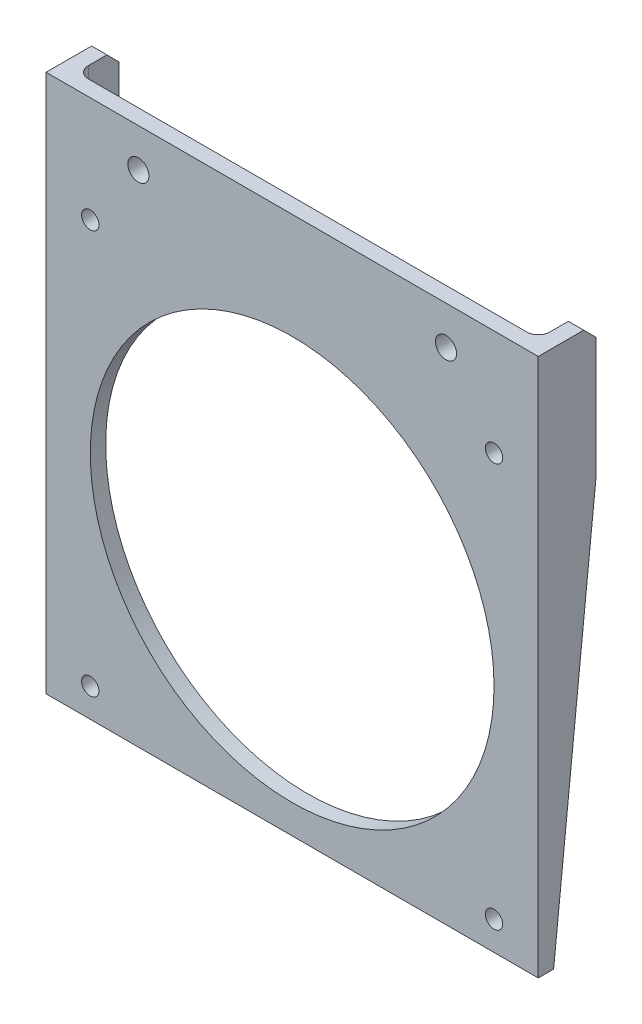
ISO-10303-21;
HEADER;
FILE_DESCRIPTION(('STEP AP214'),'2;1');
FILE_NAME('part.step','',(''),(''),'','','');
FILE_SCHEMA(('AUTOMOTIVE_DESIGN { 1 0 10303 214 1 1 1 1 }'));
ENDSEC;
DATA;
#1=APPLICATION_CONTEXT('core data for automotive mechanical design processes');
#2=APPLICATION_PROTOCOL_DEFINITION('international standard','automotive_design',2000,#1);
#3=PRODUCT_CONTEXT('',#1,'mechanical');
#4=PRODUCT('Part','Part','',(#3));
#5=PRODUCT_RELATED_PRODUCT_CATEGORY('part','',(#4));
#6=PRODUCT_DEFINITION_FORMATION('','',#4);
#7=PRODUCT_DEFINITION_CONTEXT('part definition',#1,'design');
#8=PRODUCT_DEFINITION('design','',#6,#7);
#9=PRODUCT_DEFINITION_SHAPE('','',#8);
#10=(LENGTH_UNIT() NAMED_UNIT(*) SI_UNIT(.MILLI.,.METRE.));
#11=(NAMED_UNIT(*) PLANE_ANGLE_UNIT() SI_UNIT($,.RADIAN.));
#12=(NAMED_UNIT(*) SI_UNIT($,.STERADIAN.) SOLID_ANGLE_UNIT());
#13=UNCERTAINTY_MEASURE_WITH_UNIT(LENGTH_MEASURE(1.E-05),#10,'distance_accuracy_value','');
#14=(GEOMETRIC_REPRESENTATION_CONTEXT(3) GLOBAL_UNCERTAINTY_ASSIGNED_CONTEXT((#13)) GLOBAL_UNIT_ASSIGNED_CONTEXT((#10,
#11,#12)) REPRESENTATION_CONTEXT('',''));
#15=CARTESIAN_POINT('',(0.,0.,0.));
#16=DIRECTION('',(0.,0.,1.));
#17=DIRECTION('',(1.,0.,0.));
#18=AXIS2_PLACEMENT_3D('',#15,#16,#17);
#19=CARTESIAN_POINT('',(0.,0.,4.));
#20=DIRECTION('',(0.,0.,-1.));
#21=DIRECTION('',(-1.,0.,0.));
#22=AXIS2_PLACEMENT_3D('',#19,#20,#21);
#23=PLANE('',#22);
#24=CARTESIAN_POINT('',(20.,130.,4.));
#25=DIRECTION('',(0.,0.,1.));
#26=DIRECTION('',(1.,0.,0.));
#27=AXIS2_PLACEMENT_3D('',#24,#25,#26);
#28=CIRCLE('',#27,2.74999999999999);
#29=CARTESIAN_POINT('',(22.75,130.,4.));
#30=VERTEX_POINT('',#29);
#31=EDGE_CURVE('E229',#30,#30,#28,.T.);
#32=ORIENTED_EDGE('',*,*,#31,.F.);
#33=EDGE_LOOP('',(#32));
#34=FACE_BOUND('',#33,.T.);
#35=CARTESIAN_POINT('',(100.,130.,4.));
#36=DIRECTION('',(0.,0.,1.));
#37=DIRECTION('',(1.,0.,0.));
#38=AXIS2_PLACEMENT_3D('',#35,#36,#37);
#39=CIRCLE('',#38,2.74999999999999);
#40=CARTESIAN_POINT('',(102.75,130.,4.));
#41=VERTEX_POINT('',#40);
#42=EDGE_CURVE('E235',#41,#41,#39,.T.);
#43=ORIENTED_EDGE('',*,*,#42,.F.);
#44=EDGE_LOOP('',(#43));
#45=FACE_BOUND('',#44,.T.);
#46=CARTESIAN_POINT('',(7.5,112.5,4.));
#47=DIRECTION('',(0.,0.,1.));
#48=DIRECTION('',(1.,0.,0.));
#49=AXIS2_PLACEMENT_3D('',#46,#47,#48);
#50=CIRCLE('',#49,2.24999999999999);
#51=CARTESIAN_POINT('',(9.74999999999999,112.5,4.));
#52=VERTEX_POINT('',#51);
#53=EDGE_CURVE('E241',#52,#52,#50,.T.);
#54=ORIENTED_EDGE('',*,*,#53,.F.);
#55=EDGE_LOOP('',(#54));
#56=FACE_BOUND('',#55,.T.);
#57=CARTESIAN_POINT('',(112.5,112.5,4.));
#58=DIRECTION('',(0.,0.,1.));
#59=DIRECTION('',(1.,0.,0.));
#60=AXIS2_PLACEMENT_3D('',#57,#58,#59);
#61=CIRCLE('',#60,2.24999999999999);
#62=CARTESIAN_POINT('',(114.75,112.5,4.));
#63=VERTEX_POINT('',#62);
#64=EDGE_CURVE('E247',#63,#63,#61,.T.);
#65=ORIENTED_EDGE('',*,*,#64,.F.);
#66=EDGE_LOOP('',(#65));
#67=FACE_BOUND('',#66,.T.);
#68=CARTESIAN_POINT('',(112.5,7.5,4.));
#69=DIRECTION('',(0.,0.,1.));
#70=DIRECTION('',(1.,0.,0.));
#71=AXIS2_PLACEMENT_3D('',#68,#69,#70);
#72=CIRCLE('',#71,2.24999999999999);
#73=CARTESIAN_POINT('',(114.75,7.5,4.));
#74=VERTEX_POINT('',#73);
#75=EDGE_CURVE('E253',#74,#74,#72,.T.);
#76=ORIENTED_EDGE('',*,*,#75,.F.);
#77=EDGE_LOOP('',(#76));
#78=FACE_BOUND('',#77,.T.);
#79=CARTESIAN_POINT('',(7.5,7.5,4.));
#80=DIRECTION('',(0.,0.,1.));
#81=DIRECTION('',(1.,0.,0.));
#82=AXIS2_PLACEMENT_3D('',#79,#80,#81);
#83=CIRCLE('',#82,2.24999999999999);
#84=CARTESIAN_POINT('',(9.74999999999999,7.5,4.));
#85=VERTEX_POINT('',#84);
#86=EDGE_CURVE('E259',#85,#85,#83,.T.);
#87=ORIENTED_EDGE('',*,*,#86,.F.);
#88=EDGE_LOOP('',(#87));
#89=FACE_BOUND('',#88,.T.);
#90=DIRECTION('',(-1.,0.,0.));
#91=VECTOR('',#90,1.);
#92=CARTESIAN_POINT('',(0.,140.,4.));
#93=LINE('',#92,#91);
#94=CARTESIAN_POINT('',(124.,140.,4.));
#95=VERTEX_POINT('',#94);
#96=CARTESIAN_POINT('',(-4.,140.,4.));
#97=VERTEX_POINT('',#96);
#98=EDGE_CURVE('E144',#95,#97,#93,.T.);
#99=ORIENTED_EDGE('',*,*,#98,.T.);
#100=DIRECTION('',(0.,-1.,0.));
#101=VECTOR('',#100,1.);
#102=CARTESIAN_POINT('',(-4.,0.,4.));
#103=LINE('',#102,#101);
#104=CARTESIAN_POINT('',(-4.,0.,4.));
#105=VERTEX_POINT('',#104);
#106=EDGE_CURVE('E147',#97,#105,#103,.T.);
#107=ORIENTED_EDGE('',*,*,#106,.T.);
#108=DIRECTION('',(1.,0.,0.));
#109=VECTOR('',#108,1.);
#110=CARTESIAN_POINT('',(0.,0.,4.));
#111=LINE('',#110,#109);
#112=CARTESIAN_POINT('',(124.,0.,4.));
#113=VERTEX_POINT('',#112);
#114=EDGE_CURVE('E156',#105,#113,#111,.T.);
#115=ORIENTED_EDGE('',*,*,#114,.T.);
#116=DIRECTION('',(0.,-1.,0.));
#117=VECTOR('',#116,1.);
#118=CARTESIAN_POINT('',(124.,0.,4.));
#119=LINE('',#118,#117);
#120=EDGE_CURVE('E150',#95,#113,#119,.T.);
#121=ORIENTED_EDGE('',*,*,#120,.F.);
#122=EDGE_LOOP('',(#99,#107,#115,#121));
#123=FACE_BOUND('',#122,.T.);
#124=CARTESIAN_POINT('',(60.,60.,4.));
#125=DIRECTION('',(0.,0.,1.));
#126=DIRECTION('',(1.,0.,0.));
#127=AXIS2_PLACEMENT_3D('',#124,#125,#126);
#128=CIRCLE('',#127,52.5);
#129=CARTESIAN_POINT('',(112.5,60.,4.));
#130=VERTEX_POINT('',#129);
#131=EDGE_CURVE('E266',#130,#130,#128,.T.);
#132=ORIENTED_EDGE('',*,*,#131,.F.);
#133=EDGE_LOOP('',(#132));
#134=FACE_BOUND('',#133,.T.);
#135=ADVANCED_FACE('F39',(#34,#45,#56,#67,#78,#89,#123,#134),#23,.F.);
#136=CARTESIAN_POINT('',(0.,0.,0.));
#137=DIRECTION('',(0.,0.,-1.));
#138=DIRECTION('',(-1.,0.,0.));
#139=AXIS2_PLACEMENT_3D('',#136,#137,#138);
#140=PLANE('',#139);
#141=CARTESIAN_POINT('',(20.,130.,0.));
#142=DIRECTION('',(0.,0.,1.));
#143=DIRECTION('',(1.,0.,0.));
#144=AXIS2_PLACEMENT_3D('',#141,#142,#143);
#145=CIRCLE('',#144,2.75);
#146=CARTESIAN_POINT('',(22.75,130.,0.));
#147=VERTEX_POINT('',#146);
#148=EDGE_CURVE('E232',#147,#147,#145,.T.);
#149=ORIENTED_EDGE('',*,*,#148,.T.);
#150=EDGE_LOOP('',(#149));
#151=FACE_BOUND('',#150,.T.);
#152=CARTESIAN_POINT('',(100.,130.,0.));
#153=DIRECTION('',(0.,0.,1.));
#154=DIRECTION('',(1.,0.,0.));
#155=AXIS2_PLACEMENT_3D('',#152,#153,#154);
#156=CIRCLE('',#155,2.75);
#157=CARTESIAN_POINT('',(102.75,130.,0.));
#158=VERTEX_POINT('',#157);
#159=EDGE_CURVE('E238',#158,#158,#156,.T.);
#160=ORIENTED_EDGE('',*,*,#159,.T.);
#161=EDGE_LOOP('',(#160));
#162=FACE_BOUND('',#161,.T.);
#163=CARTESIAN_POINT('',(7.5,112.5,0.));
#164=DIRECTION('',(0.,0.,1.));
#165=DIRECTION('',(1.,0.,0.));
#166=AXIS2_PLACEMENT_3D('',#163,#164,#165);
#167=CIRCLE('',#166,2.25);
#168=CARTESIAN_POINT('',(9.75,112.5,0.));
#169=VERTEX_POINT('',#168);
#170=EDGE_CURVE('E244',#169,#169,#167,.T.);
#171=ORIENTED_EDGE('',*,*,#170,.T.);
#172=EDGE_LOOP('',(#171));
#173=FACE_BOUND('',#172,.T.);
#174=CARTESIAN_POINT('',(112.5,112.5,0.));
#175=DIRECTION('',(0.,0.,1.));
#176=DIRECTION('',(1.,0.,0.));
#177=AXIS2_PLACEMENT_3D('',#174,#175,#176);
#178=CIRCLE('',#177,2.25);
#179=CARTESIAN_POINT('',(114.75,112.5,0.));
#180=VERTEX_POINT('',#179);
#181=EDGE_CURVE('E250',#180,#180,#178,.T.);
#182=ORIENTED_EDGE('',*,*,#181,.T.);
#183=EDGE_LOOP('',(#182));
#184=FACE_BOUND('',#183,.T.);
#185=CARTESIAN_POINT('',(112.5,7.5,0.));
#186=DIRECTION('',(0.,0.,1.));
#187=DIRECTION('',(1.,0.,0.));
#188=AXIS2_PLACEMENT_3D('',#185,#186,#187);
#189=CIRCLE('',#188,2.25);
#190=CARTESIAN_POINT('',(114.75,7.5,0.));
#191=VERTEX_POINT('',#190);
#192=EDGE_CURVE('E256',#191,#191,#189,.T.);
#193=ORIENTED_EDGE('',*,*,#192,.T.);
#194=EDGE_LOOP('',(#193));
#195=FACE_BOUND('',#194,.T.);
#196=CARTESIAN_POINT('',(7.5,7.5,0.));
#197=DIRECTION('',(0.,0.,1.));
#198=DIRECTION('',(1.,0.,0.));
#199=AXIS2_PLACEMENT_3D('',#196,#197,#198);
#200=CIRCLE('',#199,2.25);
#201=CARTESIAN_POINT('',(9.75,7.5,0.));
#202=VERTEX_POINT('',#201);
#203=EDGE_CURVE('E262',#202,#202,#200,.T.);
#204=ORIENTED_EDGE('',*,*,#203,.T.);
#205=EDGE_LOOP('',(#204));
#206=FACE_BOUND('',#205,.T.);
#207=DIRECTION('',(-1.,0.,0.));
#208=VECTOR('',#207,1.);
#209=CARTESIAN_POINT('',(0.,140.,0.));
#210=LINE('',#209,#208);
#211=CARTESIAN_POINT('',(117.,140.,0.));
#212=VERTEX_POINT('',#211);
#213=CARTESIAN_POINT('',(3.,140.,0.));
#214=VERTEX_POINT('',#213);
#215=EDGE_CURVE('E272',#212,#214,#210,.T.);
#216=ORIENTED_EDGE('',*,*,#215,.F.);
#217=DIRECTION('',(0.,1.,0.));
#218=VECTOR('',#217,1.);
#219=CARTESIAN_POINT('',(117.,0.,0.));
#220=LINE('',#219,#218);
#221=CARTESIAN_POINT('',(117.,0.,0.));
#222=VERTEX_POINT('',#221);
#223=EDGE_CURVE('E279',#212,#222,#220,.F.);
#224=ORIENTED_EDGE('',*,*,#223,.T.);
#225=DIRECTION('',(1.,0.,0.));
#226=VECTOR('',#225,1.);
#227=CARTESIAN_POINT('',(0.,0.,0.));
#228=LINE('',#227,#226);
#229=CARTESIAN_POINT('',(3.,0.,0.));
#230=VERTEX_POINT('',#229);
#231=EDGE_CURVE('E269',#230,#222,#228,.T.);
#232=ORIENTED_EDGE('',*,*,#231,.F.);
#233=DIRECTION('',(0.,-1.,0.));
#234=VECTOR('',#233,1.);
#235=CARTESIAN_POINT('',(3.,140.,0.));
#236=LINE('',#235,#234);
#237=EDGE_CURVE('E79',#230,#214,#236,.F.);
#238=ORIENTED_EDGE('',*,*,#237,.T.);
#239=EDGE_LOOP('',(#216,#224,#232,#238));
#240=FACE_BOUND('',#239,.T.);
#241=CARTESIAN_POINT('',(60.,60.,0.));
#242=DIRECTION('',(0.,0.,1.));
#243=DIRECTION('',(1.,0.,0.));
#244=AXIS2_PLACEMENT_3D('',#241,#242,#243);
#245=CIRCLE('',#244,52.5);
#246=CARTESIAN_POINT('',(112.5,60.,0.));
#247=VERTEX_POINT('',#246);
#248=EDGE_CURVE('E265',#247,#247,#245,.T.);
#249=ORIENTED_EDGE('',*,*,#248,.T.);
#250=EDGE_LOOP('',(#249));
#251=FACE_BOUND('',#250,.T.);
#252=ADVANCED_FACE('F317',(#151,#162,#173,#184,#195,#206,#240,#251),#140,.T.);
#253=CARTESIAN_POINT('',(0.,0.,4.));
#254=DIRECTION('',(0.,1.,0.));
#255=DIRECTION('',(0.,0.,1.));
#256=AXIS2_PLACEMENT_3D('',#253,#254,#255);
#257=PLANE('',#256);
#258=DIRECTION('',(1.,0.,0.));
#259=VECTOR('',#258,1.);
#260=CARTESIAN_POINT('',(-4.,0.,0.));
#261=LINE('',#260,#259);
#262=CARTESIAN_POINT('',(-4.,0.,0.));
#263=VERTEX_POINT('',#262);
#264=EDGE_CURVE('E54',#263,#230,#261,.T.);
#265=ORIENTED_EDGE('',*,*,#264,.T.);
#266=ORIENTED_EDGE('',*,*,#231,.T.);
#267=DIRECTION('',(-1.,0.,0.));
#268=VECTOR('',#267,1.);
#269=CARTESIAN_POINT('',(124.,0.,0.));
#270=LINE('',#269,#268);
#271=CARTESIAN_POINT('',(124.,0.,0.));
#272=VERTEX_POINT('',#271);
#273=EDGE_CURVE('E73',#272,#222,#270,.T.);
#274=ORIENTED_EDGE('',*,*,#273,.F.);
#275=DIRECTION('',(0.,0.,-1.));
#276=VECTOR('',#275,1.);
#277=CARTESIAN_POINT('',(124.,0.,0.));
#278=LINE('',#277,#276);
#279=EDGE_CURVE('E202',#113,#272,#278,.T.);
#280=ORIENTED_EDGE('',*,*,#279,.F.);
#281=ORIENTED_EDGE('',*,*,#114,.F.);
#282=DIRECTION('',(0.,0.,-1.));
#283=VECTOR('',#282,1.);
#284=CARTESIAN_POINT('',(-4.,0.,0.));
#285=LINE('',#284,#283);
#286=EDGE_CURVE('E165',#105,#263,#285,.T.);
#287=ORIENTED_EDGE('',*,*,#286,.T.);
#288=EDGE_LOOP('',(#265,#266,#274,#280,#281,#287));
#289=FACE_BOUND('',#288,.T.);
#290=ADVANCED_FACE('F299',(#289),#257,.F.);
#291=CARTESIAN_POINT('',(0.,140.,4.));
#292=DIRECTION('',(0.,-1.,0.));
#293=DIRECTION('',(0.,0.,-1.));
#294=AXIS2_PLACEMENT_3D('',#291,#292,#293);
#295=PLANE('',#294);
#296=DIRECTION('',(0.,0.,1.));
#297=VECTOR('',#296,1.);
#298=CARTESIAN_POINT('',(120.,140.,4.));
#299=LINE('',#298,#297);
#300=CARTESIAN_POINT('',(120.,140.,-7.82911983394996));
#301=VERTEX_POINT('',#300);
#302=CARTESIAN_POINT('',(120.,140.,-3.));
#303=VERTEX_POINT('',#302);
#304=EDGE_CURVE('E203',#301,#303,#299,.T.);
#305=ORIENTED_EDGE('',*,*,#304,.T.);
#306=CARTESIAN_POINT('',(117.,140.,-3.));
#307=DIRECTION('',(0.,-1.,0.));
#308=DIRECTION('',(0.,0.,-1.));
#309=AXIS2_PLACEMENT_3D('',#306,#307,#308);
#310=CIRCLE('',#309,3.);
#311=EDGE_CURVE('E283',#303,#212,#310,.T.);
#312=ORIENTED_EDGE('',*,*,#311,.T.);
#313=ORIENTED_EDGE('',*,*,#215,.T.);
#314=CARTESIAN_POINT('',(3.,140.,-3.));
#315=DIRECTION('',(0.,-1.,0.));
#316=DIRECTION('',(0.,0.,-1.));
#317=AXIS2_PLACEMENT_3D('',#314,#315,#316);
#318=CIRCLE('',#317,3.);
#319=CARTESIAN_POINT('',(0.,140.,-3.));
#320=VERTEX_POINT('',#319);
#321=EDGE_CURVE('E11',#214,#320,#318,.T.);
#322=ORIENTED_EDGE('',*,*,#321,.T.);
#323=DIRECTION('',(0.,0.,1.));
#324=VECTOR('',#323,1.);
#325=CARTESIAN_POINT('',(0.,140.,4.));
#326=LINE('',#325,#324);
#327=CARTESIAN_POINT('',(0.,140.,-7.82911983394996));
#328=VERTEX_POINT('',#327);
#329=EDGE_CURVE('E183',#328,#320,#326,.T.);
#330=ORIENTED_EDGE('',*,*,#329,.F.);
#331=DIRECTION('',(1.,0.,0.));
#332=VECTOR('',#331,1.);
#333=CARTESIAN_POINT('',(-4.,140.,-7.82911983394996));
#334=LINE('',#333,#332);
#335=CARTESIAN_POINT('',(-4.,140.,-7.82911983394996));
#336=VERTEX_POINT('',#335);
#337=EDGE_CURVE('E171',#336,#328,#334,.T.);
#338=ORIENTED_EDGE('',*,*,#337,.F.);
#339=DIRECTION('',(0.,0.,1.));
#340=VECTOR('',#339,1.);
#341=CARTESIAN_POINT('',(-4.,140.,4.));
#342=LINE('',#341,#340);
#343=EDGE_CURVE('E162',#336,#97,#342,.T.);
#344=ORIENTED_EDGE('',*,*,#343,.T.);
#345=ORIENTED_EDGE('',*,*,#98,.F.);
#346=DIRECTION('',(0.,0.,1.));
#347=VECTOR('',#346,1.);
#348=CARTESIAN_POINT('',(124.,140.,4.));
#349=LINE('',#348,#347);
#350=CARTESIAN_POINT('',(124.,140.,-7.82911983394996));
#351=VERTEX_POINT('',#350);
#352=EDGE_CURVE('E211',#351,#95,#349,.T.);
#353=ORIENTED_EDGE('',*,*,#352,.F.);
#354=DIRECTION('',(-1.,0.,0.));
#355=VECTOR('',#354,1.);
#356=CARTESIAN_POINT('',(124.,140.,-7.82911983394996));
#357=LINE('',#356,#355);
#358=EDGE_CURVE('E213',#351,#301,#357,.T.);
#359=ORIENTED_EDGE('',*,*,#358,.T.);
#360=EDGE_LOOP('',(#305,#312,#313,#322,#330,#338,#344,#345,#353,#359));
#361=FACE_BOUND('',#360,.T.);
#362=ADVANCED_FACE('F169',(#361),#295,.F.);
#363=CARTESIAN_POINT('',(60.,60.,4.));
#364=DIRECTION('',(0.,0.,-1.));
#365=DIRECTION('',(-1.,0.,0.));
#366=AXIS2_PLACEMENT_3D('',#363,#364,#365);
#367=CYLINDRICAL_SURFACE('',#366,52.5);
#368=ORIENTED_EDGE('',*,*,#131,.T.);
#369=EDGE_LOOP('',(#368));
#370=FACE_BOUND('',#369,.T.);
#371=ORIENTED_EDGE('',*,*,#248,.F.);
#372=EDGE_LOOP('',(#371));
#373=FACE_BOUND('',#372,.T.);
#374=ADVANCED_FACE('F324',(#370,#373),#367,.F.);
#375=CARTESIAN_POINT('',(7.5,7.5,4.));
#376=DIRECTION('',(0.,0.,1.));
#377=DIRECTION('',(1.,0.,0.));
#378=AXIS2_PLACEMENT_3D('',#375,#376,#377);
#379=CYLINDRICAL_SURFACE('',#378,2.24999999999999);
#380=ORIENTED_EDGE('',*,*,#203,.F.);
#381=EDGE_LOOP('',(#380));
#382=FACE_BOUND('',#381,.T.);
#383=ORIENTED_EDGE('',*,*,#86,.T.);
#384=EDGE_LOOP('',(#383));
#385=FACE_BOUND('',#384,.T.);
#386=ADVANCED_FACE('F326',(#382,#385),#379,.F.);
#387=CARTESIAN_POINT('',(112.5,7.5,4.));
#388=DIRECTION('',(0.,0.,1.));
#389=DIRECTION('',(1.,0.,0.));
#390=AXIS2_PLACEMENT_3D('',#387,#388,#389);
#391=CYLINDRICAL_SURFACE('',#390,2.25);
#392=ORIENTED_EDGE('',*,*,#192,.F.);
#393=EDGE_LOOP('',(#392));
#394=FACE_BOUND('',#393,.T.);
#395=ORIENTED_EDGE('',*,*,#75,.T.);
#396=EDGE_LOOP('',(#395));
#397=FACE_BOUND('',#396,.T.);
#398=ADVANCED_FACE('F332',(#394,#397),#391,.F.);
#399=CARTESIAN_POINT('',(112.5,112.5,4.));
#400=DIRECTION('',(0.,0.,1.));
#401=DIRECTION('',(1.,0.,0.));
#402=AXIS2_PLACEMENT_3D('',#399,#400,#401);
#403=CYLINDRICAL_SURFACE('',#402,2.25);
#404=ORIENTED_EDGE('',*,*,#181,.F.);
#405=EDGE_LOOP('',(#404));
#406=FACE_BOUND('',#405,.T.);
#407=ORIENTED_EDGE('',*,*,#64,.T.);
#408=EDGE_LOOP('',(#407));
#409=FACE_BOUND('',#408,.T.);
#410=ADVANCED_FACE('F388',(#406,#409),#403,.F.);
#411=CARTESIAN_POINT('',(7.5,112.5,4.));
#412=DIRECTION('',(0.,0.,1.));
#413=DIRECTION('',(1.,0.,0.));
#414=AXIS2_PLACEMENT_3D('',#411,#412,#413);
#415=CYLINDRICAL_SURFACE('',#414,2.24999999999999);
#416=ORIENTED_EDGE('',*,*,#170,.F.);
#417=EDGE_LOOP('',(#416));
#418=FACE_BOUND('',#417,.T.);
#419=ORIENTED_EDGE('',*,*,#53,.T.);
#420=EDGE_LOOP('',(#419));
#421=FACE_BOUND('',#420,.T.);
#422=ADVANCED_FACE('F384',(#418,#421),#415,.F.);
#423=CARTESIAN_POINT('',(100.,130.,4.));
#424=DIRECTION('',(0.,0.,1.));
#425=DIRECTION('',(1.,0.,0.));
#426=AXIS2_PLACEMENT_3D('',#423,#424,#425);
#427=CYLINDRICAL_SURFACE('',#426,2.75);
#428=ORIENTED_EDGE('',*,*,#159,.F.);
#429=EDGE_LOOP('',(#428));
#430=FACE_BOUND('',#429,.T.);
#431=ORIENTED_EDGE('',*,*,#42,.T.);
#432=EDGE_LOOP('',(#431));
#433=FACE_BOUND('',#432,.T.);
#434=ADVANCED_FACE('F380',(#430,#433),#427,.F.);
#435=CARTESIAN_POINT('',(20.,130.,4.));
#436=DIRECTION('',(0.,0.,1.));
#437=DIRECTION('',(1.,0.,0.));
#438=AXIS2_PLACEMENT_3D('',#435,#436,#437);
#439=CYLINDRICAL_SURFACE('',#438,2.74999999999999);
#440=ORIENTED_EDGE('',*,*,#148,.F.);
#441=EDGE_LOOP('',(#440));
#442=FACE_BOUND('',#441,.T.);
#443=ORIENTED_EDGE('',*,*,#31,.T.);
#444=EDGE_LOOP('',(#443));
#445=FACE_BOUND('',#444,.T.);
#446=ADVANCED_FACE('F377',(#442,#445),#439,.F.);
#447=CARTESIAN_POINT('',(124.,105.,-11.));
#448=DIRECTION('',(0.,0.104191710010702,0.994557231920339));
#449=DIRECTION('',(0.,-0.994557231920339,0.104191710010702));
#450=AXIS2_PLACEMENT_3D('',#447,#448,#449);
#451=PLANE('',#450);
#452=ORIENTED_EDGE('',*,*,#273,.T.);
#453=CARTESIAN_POINT('',(117.,28.6363636363636,-3.));
#454=DIRECTION('',(0.,0.104191710010702,0.994557231920339));
#455=DIRECTION('',(0.,-0.994557231920339,0.104191710010702));
#456=AXIS2_PLACEMENT_3D('',#453,#454,#455);
#457=ELLIPSE('',#456,28.7930776804781,3.);
#458=CARTESIAN_POINT('',(120.,28.6363636363636,-3.));
#459=VERTEX_POINT('',#458);
#460=EDGE_CURVE('E285',#222,#459,#457,.T.);
#461=ORIENTED_EDGE('',*,*,#460,.T.);
#462=DIRECTION('',(0.,0.994557231920338,-0.104191710010702));
#463=VECTOR('',#462,1.);
#464=CARTESIAN_POINT('',(120.,105.,-11.));
#465=LINE('',#464,#463);
#466=CARTESIAN_POINT('',(120.,105.,-11.));
#467=VERTEX_POINT('',#466);
#468=EDGE_CURVE('E200',#459,#467,#465,.T.);
#469=ORIENTED_EDGE('',*,*,#468,.T.);
#470=DIRECTION('',(-1.,0.,0.));
#471=VECTOR('',#470,1.);
#472=CARTESIAN_POINT('',(124.,105.,-11.));
#473=LINE('',#472,#471);
#474=CARTESIAN_POINT('',(124.,105.,-11.));
#475=VERTEX_POINT('',#474);
#476=EDGE_CURVE('E225',#475,#467,#473,.T.);
#477=ORIENTED_EDGE('',*,*,#476,.F.);
#478=DIRECTION('',(0.,0.994557231920338,-0.104191710010702));
#479=VECTOR('',#478,1.);
#480=CARTESIAN_POINT('',(124.,105.,-11.));
#481=LINE('',#480,#479);
#482=EDGE_CURVE('E205',#272,#475,#481,.T.);
#483=ORIENTED_EDGE('',*,*,#482,.F.);
#484=EDGE_LOOP('',(#452,#461,#469,#477,#483));
#485=FACE_BOUND('',#484,.T.);
#486=ADVANCED_FACE('F373',(#485),#451,.F.);
#487=CARTESIAN_POINT('',(124.,136.82911983395,-11.));
#488=DIRECTION('',(0.,0.,1.));
#489=DIRECTION('',(0.,-1.,0.));
#490=AXIS2_PLACEMENT_3D('',#487,#488,#489);
#491=PLANE('',#490);
#492=DIRECTION('',(0.,1.,0.));
#493=VECTOR('',#492,1.);
#494=CARTESIAN_POINT('',(120.,136.82911983395,-11.));
#495=LINE('',#494,#493);
#496=CARTESIAN_POINT('',(120.,136.82911983395,-11.));
#497=VERTEX_POINT('',#496);
#498=EDGE_CURVE('E215',#467,#497,#495,.T.);
#499=ORIENTED_EDGE('',*,*,#498,.T.);
#500=DIRECTION('',(-1.,0.,0.));
#501=VECTOR('',#500,1.);
#502=CARTESIAN_POINT('',(124.,136.82911983395,-11.));
#503=LINE('',#502,#501);
#504=CARTESIAN_POINT('',(124.,136.82911983395,-11.));
#505=VERTEX_POINT('',#504);
#506=EDGE_CURVE('E222',#505,#497,#503,.T.);
#507=ORIENTED_EDGE('',*,*,#506,.F.);
#508=DIRECTION('',(0.,1.,0.));
#509=VECTOR('',#508,1.);
#510=CARTESIAN_POINT('',(124.,136.82911983395,-11.));
#511=LINE('',#510,#509);
#512=EDGE_CURVE('E207',#475,#505,#511,.T.);
#513=ORIENTED_EDGE('',*,*,#512,.F.);
#514=ORIENTED_EDGE('',*,*,#476,.T.);
#515=EDGE_LOOP('',(#499,#507,#513,#514));
#516=FACE_BOUND('',#515,.T.);
#517=ADVANCED_FACE('F370',(#516),#491,.F.);
#518=CARTESIAN_POINT('',(124.,140.,-7.82911983394996));
#519=DIRECTION('',(0.,-0.707106781186546,0.707106781186549));
#520=DIRECTION('',(0.,-0.707106781186549,-0.707106781186546));
#521=AXIS2_PLACEMENT_3D('',#518,#519,#520);
#522=PLANE('',#521);
#523=DIRECTION('',(0.,0.707106781186549,0.707106781186546));
#524=VECTOR('',#523,1.);
#525=CARTESIAN_POINT('',(120.,140.,-7.82911983394996));
#526=LINE('',#525,#524);
#527=EDGE_CURVE('E217',#497,#301,#526,.T.);
#528=ORIENTED_EDGE('',*,*,#527,.T.);
#529=ORIENTED_EDGE('',*,*,#358,.F.);
#530=DIRECTION('',(0.,0.707106781186549,0.707106781186546));
#531=VECTOR('',#530,1.);
#532=CARTESIAN_POINT('',(124.,140.,-7.82911983394996));
#533=LINE('',#532,#531);
#534=EDGE_CURVE('E209',#505,#351,#533,.T.);
#535=ORIENTED_EDGE('',*,*,#534,.F.);
#536=ORIENTED_EDGE('',*,*,#506,.T.);
#537=EDGE_LOOP('',(#528,#529,#535,#536));
#538=FACE_BOUND('',#537,.T.);
#539=ADVANCED_FACE('F365',(#538),#522,.F.);
#540=CARTESIAN_POINT('',(124.,0.,0.));
#541=DIRECTION('',(-1.,0.,0.));
#542=DIRECTION('',(0.,0.,1.));
#543=AXIS2_PLACEMENT_3D('',#540,#541,#542);
#544=PLANE('',#543);
#545=ORIENTED_EDGE('',*,*,#120,.T.);
#546=ORIENTED_EDGE('',*,*,#279,.T.);
#547=ORIENTED_EDGE('',*,*,#482,.T.);
#548=ORIENTED_EDGE('',*,*,#512,.T.);
#549=ORIENTED_EDGE('',*,*,#534,.T.);
#550=ORIENTED_EDGE('',*,*,#352,.T.);
#551=EDGE_LOOP('',(#545,#546,#547,#548,#549,#550));
#552=FACE_BOUND('',#551,.T.);
#553=ADVANCED_FACE('F302',(#552),#544,.F.);
#554=CARTESIAN_POINT('',(120.,0.,0.));
#555=DIRECTION('',(-1.,0.,0.));
#556=DIRECTION('',(0.,0.,1.));
#557=AXIS2_PLACEMENT_3D('',#554,#555,#556);
#558=PLANE('',#557);
#559=ORIENTED_EDGE('',*,*,#468,.F.);
#560=DIRECTION('',(0.,1.,0.));
#561=VECTOR('',#560,1.);
#562=CARTESIAN_POINT('',(120.,140.,-3.));
#563=LINE('',#562,#561);
#564=EDGE_CURVE('E155',#459,#303,#563,.T.);
#565=ORIENTED_EDGE('',*,*,#564,.T.);
#566=ORIENTED_EDGE('',*,*,#304,.F.);
#567=ORIENTED_EDGE('',*,*,#527,.F.);
#568=ORIENTED_EDGE('',*,*,#498,.F.);
#569=EDGE_LOOP('',(#559,#565,#566,#567,#568));
#570=FACE_BOUND('',#569,.T.);
#571=ADVANCED_FACE('F310',(#570),#558,.T.);
#572=CARTESIAN_POINT('',(-4.,140.,-7.82911983394996));
#573=DIRECTION('',(0.,0.707106781186546,-0.707106781186549));
#574=DIRECTION('',(0.,0.707106781186549,0.707106781186546));
#575=AXIS2_PLACEMENT_3D('',#572,#573,#574);
#576=PLANE('',#575);
#577=DIRECTION('',(0.,0.707106781186549,0.707106781186546));
#578=VECTOR('',#577,1.);
#579=CARTESIAN_POINT('',(0.,140.,-7.82911983394996));
#580=LINE('',#579,#578);
#581=CARTESIAN_POINT('',(0.,136.82911983395,-11.));
#582=VERTEX_POINT('',#581);
#583=EDGE_CURVE('E186',#582,#328,#580,.T.);
#584=ORIENTED_EDGE('',*,*,#583,.F.);
#585=DIRECTION('',(1.,0.,0.));
#586=VECTOR('',#585,1.);
#587=CARTESIAN_POINT('',(-4.,136.82911983395,-11.));
#588=LINE('',#587,#586);
#589=CARTESIAN_POINT('',(-4.,136.82911983395,-11.));
#590=VERTEX_POINT('',#589);
#591=EDGE_CURVE('E197',#590,#582,#588,.T.);
#592=ORIENTED_EDGE('',*,*,#591,.F.);
#593=DIRECTION('',(0.,0.707106781186549,0.707106781186546));
#594=VECTOR('',#593,1.);
#595=CARTESIAN_POINT('',(-4.,140.,-7.82911983394996));
#596=LINE('',#595,#594);
#597=EDGE_CURVE('E172',#590,#336,#596,.T.);
#598=ORIENTED_EDGE('',*,*,#597,.T.);
#599=ORIENTED_EDGE('',*,*,#337,.T.);
#600=EDGE_LOOP('',(#584,#592,#598,#599));
#601=FACE_BOUND('',#600,.T.);
#602=ADVANCED_FACE('F295',(#601),#576,.T.);
#603=CARTESIAN_POINT('',(-4.,136.82911983395,-11.));
#604=DIRECTION('',(0.,0.,-1.));
#605=DIRECTION('',(0.,1.,0.));
#606=AXIS2_PLACEMENT_3D('',#603,#604,#605);
#607=PLANE('',#606);
#608=DIRECTION('',(0.,1.,0.));
#609=VECTOR('',#608,1.);
#610=CARTESIAN_POINT('',(0.,136.82911983395,-11.));
#611=LINE('',#610,#609);
#612=CARTESIAN_POINT('',(0.,105.,-11.));
#613=VERTEX_POINT('',#612);
#614=EDGE_CURVE('E189',#613,#582,#611,.T.);
#615=ORIENTED_EDGE('',*,*,#614,.F.);
#616=DIRECTION('',(1.,0.,0.));
#617=VECTOR('',#616,1.);
#618=CARTESIAN_POINT('',(-4.,105.,-11.));
#619=LINE('',#618,#617);
#620=CARTESIAN_POINT('',(-4.,105.,-11.));
#621=VERTEX_POINT('',#620);
#622=EDGE_CURVE('E194',#621,#613,#619,.T.);
#623=ORIENTED_EDGE('',*,*,#622,.F.);
#624=DIRECTION('',(0.,1.,0.));
#625=VECTOR('',#624,1.);
#626=CARTESIAN_POINT('',(-4.,136.82911983395,-11.));
#627=LINE('',#626,#625);
#628=EDGE_CURVE('E174',#621,#590,#627,.T.);
#629=ORIENTED_EDGE('',*,*,#628,.T.);
#630=ORIENTED_EDGE('',*,*,#591,.T.);
#631=EDGE_LOOP('',(#615,#623,#629,#630));
#632=FACE_BOUND('',#631,.T.);
#633=ADVANCED_FACE('F298',(#632),#607,.T.);
#634=CARTESIAN_POINT('',(-4.,105.,-11.));
#635=DIRECTION('',(0.,-0.104191710010702,-0.994557231920339));
#636=DIRECTION('',(0.,0.994557231920339,-0.104191710010702));
#637=AXIS2_PLACEMENT_3D('',#634,#635,#636);
#638=PLANE('',#637);
#639=DIRECTION('',(0.,0.994557231920338,-0.104191710010702));
#640=VECTOR('',#639,1.);
#641=CARTESIAN_POINT('',(0.,105.,-11.));
#642=LINE('',#641,#640);
#643=CARTESIAN_POINT('',(0.,28.6363636363636,-3.));
#644=VERTEX_POINT('',#643);
#645=EDGE_CURVE('E166',#644,#613,#642,.T.);
#646=ORIENTED_EDGE('',*,*,#645,.F.);
#647=CARTESIAN_POINT('',(3.,28.6363636363636,-3.));
#648=DIRECTION('',(0.,-0.104191710010702,-0.994557231920339));
#649=DIRECTION('',(0.,0.994557231920339,-0.104191710010702));
#650=AXIS2_PLACEMENT_3D('',#647,#648,#649);
#651=ELLIPSE('',#650,28.7930776804781,3.);
#652=EDGE_CURVE('E47',#644,#230,#651,.F.);
#653=ORIENTED_EDGE('',*,*,#652,.T.);
#654=ORIENTED_EDGE('',*,*,#264,.F.);
#655=DIRECTION('',(0.,0.994557231920338,-0.104191710010702));
#656=VECTOR('',#655,1.);
#657=CARTESIAN_POINT('',(-4.,105.,-11.));
#658=LINE('',#657,#656);
#659=EDGE_CURVE('E179',#263,#621,#658,.T.);
#660=ORIENTED_EDGE('',*,*,#659,.T.);
#661=ORIENTED_EDGE('',*,*,#622,.T.);
#662=EDGE_LOOP('',(#646,#653,#654,#660,#661));
#663=FACE_BOUND('',#662,.T.);
#664=ADVANCED_FACE('F288',(#663),#638,.T.);
#665=CARTESIAN_POINT('',(-4.,0.,0.));
#666=DIRECTION('',(1.,0.,0.));
#667=DIRECTION('',(0.,0.,1.));
#668=AXIS2_PLACEMENT_3D('',#665,#666,#667);
#669=PLANE('',#668);
#670=ORIENTED_EDGE('',*,*,#106,.F.);
#671=ORIENTED_EDGE('',*,*,#343,.F.);
#672=ORIENTED_EDGE('',*,*,#597,.F.);
#673=ORIENTED_EDGE('',*,*,#628,.F.);
#674=ORIENTED_EDGE('',*,*,#659,.F.);
#675=ORIENTED_EDGE('',*,*,#286,.F.);
#676=EDGE_LOOP('',(#670,#671,#672,#673,#674,#675));
#677=FACE_BOUND('',#676,.T.);
#678=ADVANCED_FACE('F160',(#677),#669,.F.);
#679=CARTESIAN_POINT('',(0.,0.,0.));
#680=DIRECTION('',(1.,0.,0.));
#681=DIRECTION('',(0.,0.,1.));
#682=AXIS2_PLACEMENT_3D('',#679,#680,#681);
#683=PLANE('',#682);
#684=ORIENTED_EDGE('',*,*,#329,.T.);
#685=DIRECTION('',(0.,-1.,0.));
#686=VECTOR('',#685,1.);
#687=CARTESIAN_POINT('',(0.,0.,-3.));
#688=LINE('',#687,#686);
#689=EDGE_CURVE('E281',#320,#644,#688,.T.);
#690=ORIENTED_EDGE('',*,*,#689,.T.);
#691=ORIENTED_EDGE('',*,*,#645,.T.);
#692=ORIENTED_EDGE('',*,*,#614,.T.);
#693=ORIENTED_EDGE('',*,*,#583,.T.);
#694=EDGE_LOOP('',(#684,#690,#691,#692,#693));
#695=FACE_BOUND('',#694,.T.);
#696=ADVANCED_FACE('F291',(#695),#683,.T.);
#697=CARTESIAN_POINT('',(117.,0.,-3.));
#698=DIRECTION('',(0.,-1.,0.));
#699=DIRECTION('',(0.,0.,-1.));
#700=AXIS2_PLACEMENT_3D('',#697,#698,#699);
#701=CYLINDRICAL_SURFACE('',#700,3.);
#702=ORIENTED_EDGE('',*,*,#460,.F.);
#703=ORIENTED_EDGE('',*,*,#223,.F.);
#704=ORIENTED_EDGE('',*,*,#311,.F.);
#705=ORIENTED_EDGE('',*,*,#564,.F.);
#706=EDGE_LOOP('',(#702,#703,#704,#705));
#707=FACE_BOUND('',#706,.T.);
#708=ADVANCED_FACE('F315',(#707),#701,.F.);
#709=CARTESIAN_POINT('',(3.,0.,-3.));
#710=DIRECTION('',(0.,1.,0.));
#711=DIRECTION('',(0.,0.,1.));
#712=AXIS2_PLACEMENT_3D('',#709,#710,#711);
#713=CYLINDRICAL_SURFACE('',#712,3.);
#714=ORIENTED_EDGE('',*,*,#321,.F.);
#715=ORIENTED_EDGE('',*,*,#237,.F.);
#716=ORIENTED_EDGE('',*,*,#652,.F.);
#717=ORIENTED_EDGE('',*,*,#689,.F.);
#718=EDGE_LOOP('',(#714,#715,#716,#717));
#719=FACE_BOUND('',#718,.T.);
#720=ADVANCED_FACE('F41',(#719),#713,.F.);
#721=CLOSED_SHELL('',(#135,#252,#290,#362,#374,#386,#398,#410,#422,#434,#446,#486,#517,#539,
#553,#571,#602,#633,#664,#678,#696,#708,#720));
#722=MANIFOLD_SOLID_BREP('B2',#721);
#723=ADVANCED_BREP_SHAPE_REPRESENTATION('',(#18,#722),#14);
#724=SHAPE_DEFINITION_REPRESENTATION(#9,#723);
ENDSEC;
END-ISO-10303-21;
